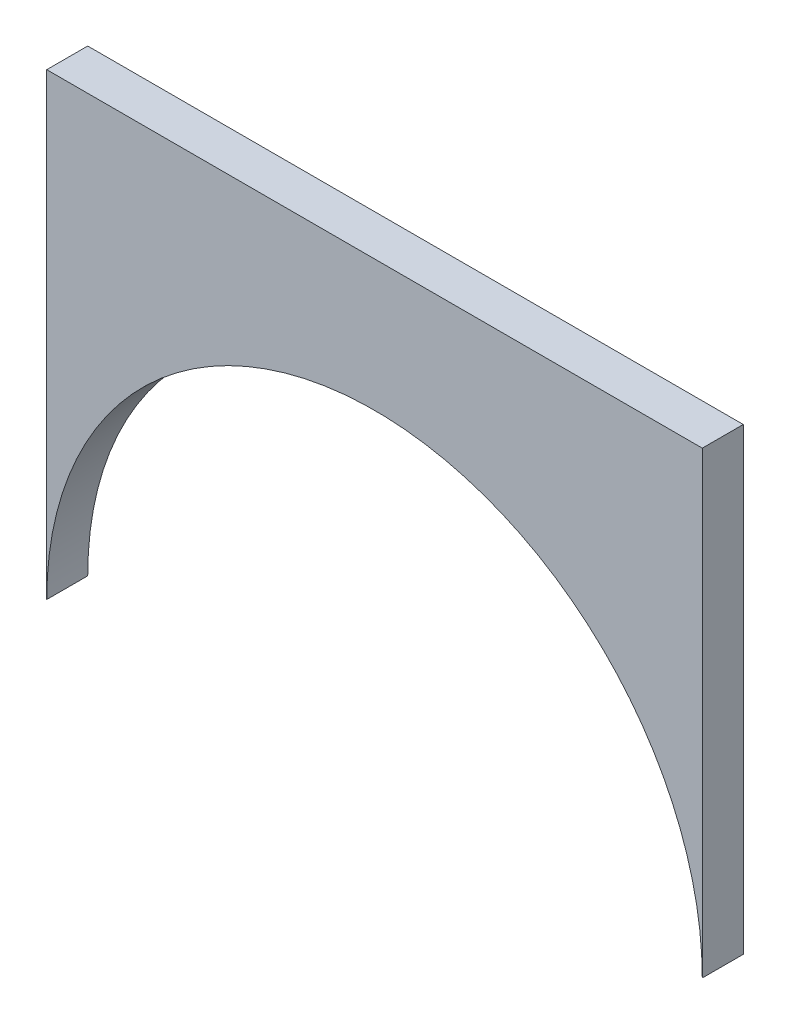
ISO-10303-21;
HEADER;
FILE_DESCRIPTION(('STEP AP214'),'2;1');
FILE_NAME('part.step','',(''),(''),'','','');
FILE_SCHEMA(('AUTOMOTIVE_DESIGN { 1 0 10303 214 1 1 1 1 }'));
ENDSEC;
DATA;
#1=APPLICATION_CONTEXT('core data for automotive mechanical design processes');
#2=APPLICATION_PROTOCOL_DEFINITION('international standard','automotive_design',2000,#1);
#3=PRODUCT_CONTEXT('',#1,'mechanical');
#4=PRODUCT('Part','Part','',(#3));
#5=PRODUCT_RELATED_PRODUCT_CATEGORY('part','',(#4));
#6=PRODUCT_DEFINITION_FORMATION('','',#4);
#7=PRODUCT_DEFINITION_CONTEXT('part definition',#1,'design');
#8=PRODUCT_DEFINITION('design','',#6,#7);
#9=PRODUCT_DEFINITION_SHAPE('','',#8);
#10=(LENGTH_UNIT() NAMED_UNIT(*) SI_UNIT(.MILLI.,.METRE.));
#11=(NAMED_UNIT(*) PLANE_ANGLE_UNIT() SI_UNIT($,.RADIAN.));
#12=(NAMED_UNIT(*) SI_UNIT($,.STERADIAN.) SOLID_ANGLE_UNIT());
#13=UNCERTAINTY_MEASURE_WITH_UNIT(LENGTH_MEASURE(1.E-05),#10,'distance_accuracy_value','');
#14=(GEOMETRIC_REPRESENTATION_CONTEXT(3) GLOBAL_UNCERTAINTY_ASSIGNED_CONTEXT((#13)) GLOBAL_UNIT_ASSIGNED_CONTEXT((#10,
#11,#12)) REPRESENTATION_CONTEXT('',''));
#15=CARTESIAN_POINT('',(0.,0.,0.));
#16=DIRECTION('',(0.,0.,1.));
#17=DIRECTION('',(1.,0.,0.));
#18=AXIS2_PLACEMENT_3D('',#15,#16,#17);
#19=CARTESIAN_POINT('',(0.,0.,2.5));
#20=DIRECTION('',(0.,0.,-1.));
#21=DIRECTION('',(-1.,0.,0.));
#22=AXIS2_PLACEMENT_3D('',#19,#20,#21);
#23=CYLINDRICAL_SURFACE('',#22,20.);
#24=CARTESIAN_POINT('',(0.,0.,0.));
#25=DIRECTION('',(0.,0.,-1.));
#26=DIRECTION('',(-1.,0.,0.));
#27=AXIS2_PLACEMENT_3D('',#24,#25,#26);
#28=CIRCLE('',#27,20.);
#29=CARTESIAN_POINT('',(-20.,0.,0.));
#30=VERTEX_POINT('',#29);
#31=CARTESIAN_POINT('',(20.,0.,0.));
#32=VERTEX_POINT('',#31);
#33=EDGE_CURVE('E111',#30,#32,#28,.T.);
#34=ORIENTED_EDGE('',*,*,#33,.T.);
#35=DIRECTION('',(0.,0.,-1.));
#36=VECTOR('',#35,1.);
#37=CARTESIAN_POINT('',(20.,0.,2.5));
#38=LINE('',#37,#36);
#39=CARTESIAN_POINT('',(20.,0.,2.5));
#40=VERTEX_POINT('',#39);
#41=EDGE_CURVE('E11',#40,#32,#38,.T.);
#42=ORIENTED_EDGE('',*,*,#41,.F.);
#43=CARTESIAN_POINT('',(0.,0.,2.5));
#44=DIRECTION('',(0.,0.,-1.));
#45=DIRECTION('',(-1.,0.,0.));
#46=AXIS2_PLACEMENT_3D('',#43,#44,#45);
#47=CIRCLE('',#46,20.);
#48=CARTESIAN_POINT('',(-20.,0.,2.5));
#49=VERTEX_POINT('',#48);
#50=EDGE_CURVE('E95',#49,#40,#47,.T.);
#51=ORIENTED_EDGE('',*,*,#50,.F.);
#52=DIRECTION('',(0.,0.,-1.));
#53=VECTOR('',#52,1.);
#54=CARTESIAN_POINT('',(-20.,0.,2.5));
#55=LINE('',#54,#53);
#56=EDGE_CURVE('E107',#49,#30,#55,.T.);
#57=ORIENTED_EDGE('',*,*,#56,.T.);
#58=EDGE_LOOP('',(#34,#42,#51,#57));
#59=FACE_BOUND('',#58,.T.);
#60=ADVANCED_FACE('F43',(#59),#23,.F.);
#61=CARTESIAN_POINT('',(20.,28.,2.5));
#62=DIRECTION('',(-1.,0.,0.));
#63=DIRECTION('',(0.,-1.,0.));
#64=AXIS2_PLACEMENT_3D('',#61,#62,#63);
#65=PLANE('',#64);
#66=DIRECTION('',(0.,1.,0.));
#67=VECTOR('',#66,1.);
#68=CARTESIAN_POINT('',(20.,28.,0.));
#69=LINE('',#68,#67);
#70=CARTESIAN_POINT('',(20.,28.,0.));
#71=VERTEX_POINT('',#70);
#72=EDGE_CURVE('E100',#32,#71,#69,.T.);
#73=ORIENTED_EDGE('',*,*,#72,.T.);
#74=DIRECTION('',(0.,0.,-1.));
#75=VECTOR('',#74,1.);
#76=CARTESIAN_POINT('',(20.,28.,2.5));
#77=LINE('',#76,#75);
#78=CARTESIAN_POINT('',(20.,28.,2.5));
#79=VERTEX_POINT('',#78);
#80=EDGE_CURVE('E52',#79,#71,#77,.T.);
#81=ORIENTED_EDGE('',*,*,#80,.F.);
#82=DIRECTION('',(0.,1.,0.));
#83=VECTOR('',#82,1.);
#84=CARTESIAN_POINT('',(20.,28.,2.5));
#85=LINE('',#84,#83);
#86=EDGE_CURVE('E90',#40,#79,#85,.T.);
#87=ORIENTED_EDGE('',*,*,#86,.F.);
#88=ORIENTED_EDGE('',*,*,#41,.T.);
#89=EDGE_LOOP('',(#73,#81,#87,#88));
#90=FACE_BOUND('',#89,.T.);
#91=ADVANCED_FACE('F99',(#90),#65,.F.);
#92=CARTESIAN_POINT('',(-20.,28.,2.5));
#93=DIRECTION('',(0.,-1.,0.));
#94=DIRECTION('',(0.,0.,-1.));
#95=AXIS2_PLACEMENT_3D('',#92,#93,#94);
#96=PLANE('',#95);
#97=DIRECTION('',(-1.,0.,0.));
#98=VECTOR('',#97,1.);
#99=CARTESIAN_POINT('',(-20.,28.,0.));
#100=LINE('',#99,#98);
#101=CARTESIAN_POINT('',(-20.,28.,0.));
#102=VERTEX_POINT('',#101);
#103=EDGE_CURVE('E77',#71,#102,#100,.T.);
#104=ORIENTED_EDGE('',*,*,#103,.T.);
#105=DIRECTION('',(0.,0.,-1.));
#106=VECTOR('',#105,1.);
#107=CARTESIAN_POINT('',(-20.,28.,2.5));
#108=LINE('',#107,#106);
#109=CARTESIAN_POINT('',(-20.,28.,2.5));
#110=VERTEX_POINT('',#109);
#111=EDGE_CURVE('E102',#110,#102,#108,.T.);
#112=ORIENTED_EDGE('',*,*,#111,.F.);
#113=DIRECTION('',(-1.,0.,0.));
#114=VECTOR('',#113,1.);
#115=CARTESIAN_POINT('',(-20.,28.,2.5));
#116=LINE('',#115,#114);
#117=EDGE_CURVE('E93',#79,#110,#116,.T.);
#118=ORIENTED_EDGE('',*,*,#117,.F.);
#119=ORIENTED_EDGE('',*,*,#80,.T.);
#120=EDGE_LOOP('',(#104,#112,#118,#119));
#121=FACE_BOUND('',#120,.T.);
#122=ADVANCED_FACE('F103',(#121),#96,.F.);
#123=CARTESIAN_POINT('',(-20.,0.,2.5));
#124=DIRECTION('',(1.,0.,0.));
#125=DIRECTION('',(0.,0.,-1.));
#126=AXIS2_PLACEMENT_3D('',#123,#124,#125);
#127=PLANE('',#126);
#128=DIRECTION('',(0.,-1.,0.));
#129=VECTOR('',#128,1.);
#130=CARTESIAN_POINT('',(-20.,0.,0.));
#131=LINE('',#130,#129);
#132=EDGE_CURVE('E83',#102,#30,#131,.T.);
#133=ORIENTED_EDGE('',*,*,#132,.T.);
#134=ORIENTED_EDGE('',*,*,#56,.F.);
#135=DIRECTION('',(0.,-1.,0.));
#136=VECTOR('',#135,1.);
#137=CARTESIAN_POINT('',(-20.,0.,2.5));
#138=LINE('',#137,#136);
#139=EDGE_CURVE('E60',#110,#49,#138,.T.);
#140=ORIENTED_EDGE('',*,*,#139,.F.);
#141=ORIENTED_EDGE('',*,*,#111,.T.);
#142=EDGE_LOOP('',(#133,#134,#140,#141));
#143=FACE_BOUND('',#142,.T.);
#144=ADVANCED_FACE('F124',(#143),#127,.F.);
#145=CARTESIAN_POINT('',(0.,0.,2.5));
#146=DIRECTION('',(0.,0.,-1.));
#147=DIRECTION('',(-1.,0.,0.));
#148=AXIS2_PLACEMENT_3D('',#145,#146,#147);
#149=PLANE('',#148);
#150=ORIENTED_EDGE('',*,*,#50,.T.);
#151=ORIENTED_EDGE('',*,*,#86,.T.);
#152=ORIENTED_EDGE('',*,*,#117,.T.);
#153=ORIENTED_EDGE('',*,*,#139,.T.);
#154=EDGE_LOOP('',(#150,#151,#152,#153));
#155=FACE_BOUND('',#154,.T.);
#156=ADVANCED_FACE('F91',(#155),#149,.F.);
#157=CARTESIAN_POINT('',(0.,0.,0.));
#158=DIRECTION('',(0.,0.,-1.));
#159=DIRECTION('',(-1.,0.,0.));
#160=AXIS2_PLACEMENT_3D('',#157,#158,#159);
#161=PLANE('',#160);
#162=ORIENTED_EDGE('',*,*,#33,.F.);
#163=ORIENTED_EDGE('',*,*,#132,.F.);
#164=ORIENTED_EDGE('',*,*,#103,.F.);
#165=ORIENTED_EDGE('',*,*,#72,.F.);
#166=EDGE_LOOP('',(#162,#163,#164,#165));
#167=FACE_BOUND('',#166,.T.);
#168=ADVANCED_FACE('F127',(#167),#161,.T.);
#169=CLOSED_SHELL('',(#60,#91,#122,#144,#156,#168));
#170=MANIFOLD_SOLID_BREP('B2',#169);
#171=ADVANCED_BREP_SHAPE_REPRESENTATION('',(#18,#170),#14);
#172=SHAPE_DEFINITION_REPRESENTATION(#9,#171);
ENDSEC;
END-ISO-10303-21;
